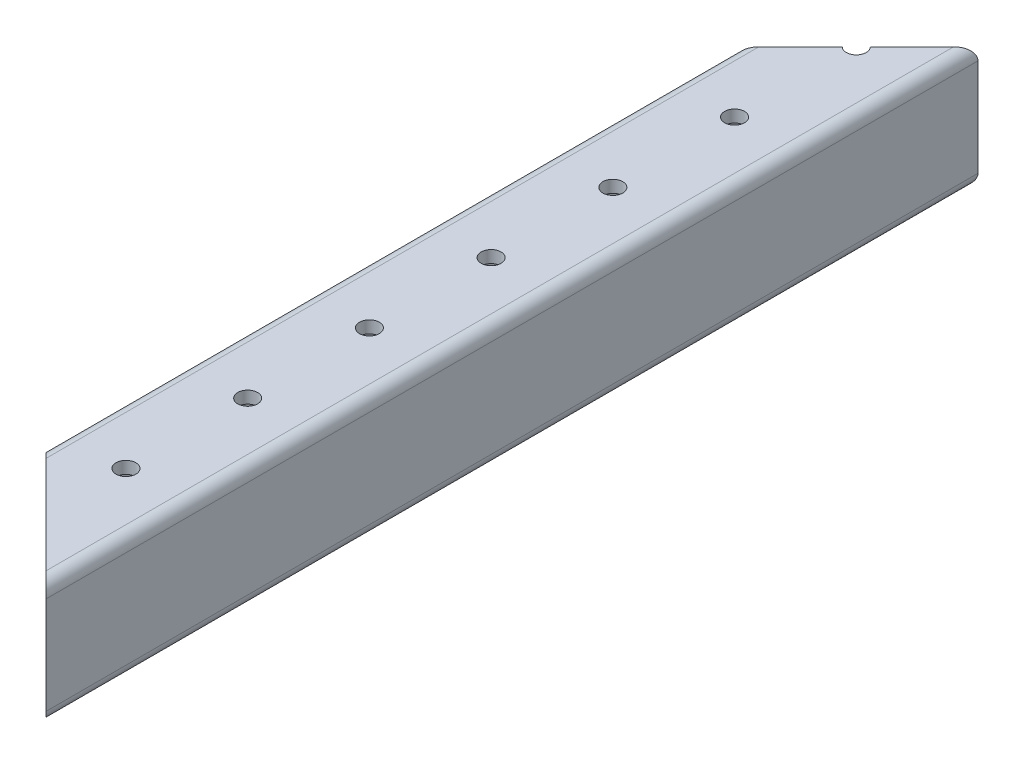
ISO-10303-21;
HEADER;
FILE_DESCRIPTION(('STEP AP214'),'2;1');
FILE_NAME('part.step','',(''),(''),'','','');
FILE_SCHEMA(('AUTOMOTIVE_DESIGN { 1 0 10303 214 1 1 1 1 }'));
ENDSEC;
DATA;
#1=APPLICATION_CONTEXT('core data for automotive mechanical design processes');
#2=APPLICATION_PROTOCOL_DEFINITION('international standard','automotive_design',2000,#1);
#3=PRODUCT_CONTEXT('',#1,'mechanical');
#4=PRODUCT('Part','Part','',(#3));
#5=PRODUCT_RELATED_PRODUCT_CATEGORY('part','',(#4));
#6=PRODUCT_DEFINITION_FORMATION('','',#4);
#7=PRODUCT_DEFINITION_CONTEXT('part definition',#1,'design');
#8=PRODUCT_DEFINITION('design','',#6,#7);
#9=PRODUCT_DEFINITION_SHAPE('','',#8);
#10=(LENGTH_UNIT() NAMED_UNIT(*) SI_UNIT(.MILLI.,.METRE.));
#11=(NAMED_UNIT(*) PLANE_ANGLE_UNIT() SI_UNIT($,.RADIAN.));
#12=(NAMED_UNIT(*) SI_UNIT($,.STERADIAN.) SOLID_ANGLE_UNIT());
#13=UNCERTAINTY_MEASURE_WITH_UNIT(LENGTH_MEASURE(1.E-05),#10,'distance_accuracy_value','');
#14=(GEOMETRIC_REPRESENTATION_CONTEXT(3) GLOBAL_UNCERTAINTY_ASSIGNED_CONTEXT((#13)) GLOBAL_UNIT_ASSIGNED_CONTEXT((#10,
#11,#12)) REPRESENTATION_CONTEXT('',''));
#15=CARTESIAN_POINT('',(0.,0.,0.));
#16=DIRECTION('',(0.,0.,1.));
#17=DIRECTION('',(1.,0.,0.));
#18=AXIS2_PLACEMENT_3D('',#15,#16,#17);
#19=CARTESIAN_POINT('',(283.757951031435,0.,-283.757951031442));
#20=DIRECTION('',(-0.707106781186539,0.,0.707106781186556));
#21=DIRECTION('',(0.707106781186556,0.,0.707106781186539));
#22=AXIS2_PLACEMENT_3D('',#19,#20,#21);
#23=PLANE('',#22);
#24=DIRECTION('',(-0.707106781186556,0.,-0.707106781186539));
#25=VECTOR('',#24,1.);
#26=CARTESIAN_POINT('',(653.327951031435,10.16,85.8120489685489));
#27=LINE('',#26,#25);
#28=CARTESIAN_POINT('',(9.66,10.16,-557.85590206287));
#29=VERTEX_POINT('',#28);
#30=CARTESIAN_POINT('',(-9.65999999999999,10.16,-577.17590206287));
#31=VERTEX_POINT('',#30);
#32=EDGE_CURVE('E424',#29,#31,#27,.T.);
#33=ORIENTED_EDGE('',*,*,#32,.F.);
#34=CARTESIAN_POINT('',(9.66,9.65999999999999,-557.85590206287));
#35=DIRECTION('',(-0.707106781186539,0.,0.707106781186556));
#36=DIRECTION('',(0.707106781186556,0.,0.707106781186539));
#37=AXIS2_PLACEMENT_3D('',#34,#35,#36);
#38=ELLIPSE('',#37,0.707106781186539,0.5);
#39=CARTESIAN_POINT('',(10.16,9.65999999999999,-557.35590206287));
#40=VERTEX_POINT('',#39);
#41=EDGE_CURVE('E437',#29,#40,#38,.F.);
#42=ORIENTED_EDGE('',*,*,#41,.T.);
#43=DIRECTION('',(0.,1.,0.));
#44=VECTOR('',#43,1.);
#45=CARTESIAN_POINT('',(10.16,-10.1600000000002,-557.35590206287));
#46=LINE('',#45,#44);
#47=CARTESIAN_POINT('',(10.16,-9.66,-557.35590206287));
#48=VERTEX_POINT('',#47);
#49=EDGE_CURVE('E445',#48,#40,#46,.T.);
#50=ORIENTED_EDGE('',*,*,#49,.F.);
#51=CARTESIAN_POINT('',(9.66,-9.66,-557.85590206287));
#52=DIRECTION('',(-0.707106781186539,0.,0.707106781186556));
#53=DIRECTION('',(0.707106781186556,0.,0.707106781186539));
#54=AXIS2_PLACEMENT_3D('',#51,#52,#53);
#55=ELLIPSE('',#54,0.707106781186539,0.5);
#56=CARTESIAN_POINT('',(9.66,-10.16,-557.85590206287));
#57=VERTEX_POINT('',#56);
#58=EDGE_CURVE('E452',#48,#57,#55,.F.);
#59=ORIENTED_EDGE('',*,*,#58,.T.);
#60=DIRECTION('',(0.707106781186556,0.,0.707106781186539));
#61=VECTOR('',#60,1.);
#62=CARTESIAN_POINT('',(653.327951031435,-10.16,85.8120489685489));
#63=LINE('',#62,#61);
#64=CARTESIAN_POINT('',(-9.66,-10.16,-577.17590206287));
#65=VERTEX_POINT('',#64);
#66=EDGE_CURVE('E455',#65,#57,#63,.T.);
#67=ORIENTED_EDGE('',*,*,#66,.F.);
#68=CARTESIAN_POINT('',(-9.65999999999999,-9.66,-577.17590206287));
#69=DIRECTION('',(-0.707106781186539,0.,0.707106781186556));
#70=DIRECTION('',(0.707106781186556,0.,0.707106781186539));
#71=AXIS2_PLACEMENT_3D('',#68,#69,#70);
#72=ELLIPSE('',#71,0.707106781186539,0.5);
#73=CARTESIAN_POINT('',(-10.16,-9.66,-577.67590206287));
#74=VERTEX_POINT('',#73);
#75=EDGE_CURVE('E449',#65,#74,#72,.F.);
#76=ORIENTED_EDGE('',*,*,#75,.T.);
#77=DIRECTION('',(0.,-1.,0.));
#78=VECTOR('',#77,1.);
#79=CARTESIAN_POINT('',(-10.16,-10.1600000000002,-577.67590206287));
#80=LINE('',#79,#78);
#81=CARTESIAN_POINT('',(-10.16,9.66,-577.67590206287));
#82=VERTEX_POINT('',#81);
#83=EDGE_CURVE('E441',#82,#74,#80,.T.);
#84=ORIENTED_EDGE('',*,*,#83,.F.);
#85=CARTESIAN_POINT('',(-9.65999999999999,9.66,-577.17590206287));
#86=DIRECTION('',(-0.707106781186539,0.,0.707106781186556));
#87=DIRECTION('',(0.707106781186556,0.,0.707106781186539));
#88=AXIS2_PLACEMENT_3D('',#85,#86,#87);
#89=ELLIPSE('',#88,0.707106781186539,0.5);
#90=EDGE_CURVE('E431',#82,#31,#89,.F.);
#91=ORIENTED_EDGE('',*,*,#90,.T.);
#92=EDGE_LOOP('',(#33,#42,#50,#59,#67,#76,#84,#91));
#93=FACE_BOUND('',#92,.T.);
#94=CARTESIAN_POINT('',(10.16,10.16,-557.35590206287));
#95=DIRECTION('',(-0.707106781186539,0.,0.707106781186556));
#96=DIRECTION('',(-0.707106781186556,0.,-0.707106781186539));
#97=AXIS2_PLACEMENT_3D('',#94,#95,#96);
#98=ELLIPSE('',#97,3.59210244842762,2.54);
#99=CARTESIAN_POINT('',(10.16,12.7,-557.35590206287));
#100=VERTEX_POINT('',#99);
#101=CARTESIAN_POINT('',(12.7,10.16,-554.81590206287));
#102=VERTEX_POINT('',#101);
#103=EDGE_CURVE('E479',#100,#102,#98,.F.);
#104=ORIENTED_EDGE('',*,*,#103,.F.);
#105=DIRECTION('',(-0.707106781186556,0.,-0.707106781186539));
#106=VECTOR('',#105,1.);
#107=CARTESIAN_POINT('',(653.327951031435,12.7,85.8120489685489));
#108=LINE('',#107,#106);
#109=CARTESIAN_POINT('',(-10.16,12.7,-577.67590206287));
#110=VERTEX_POINT('',#109);
#111=EDGE_CURVE('E459',#100,#110,#108,.T.);
#112=ORIENTED_EDGE('',*,*,#111,.T.);
#113=CARTESIAN_POINT('',(-10.16,10.16,-577.67590206287));
#114=DIRECTION('',(-0.707106781186539,0.,0.707106781186556));
#115=DIRECTION('',(-0.707106781186556,0.,-0.707106781186539));
#116=AXIS2_PLACEMENT_3D('',#113,#114,#115);
#117=ELLIPSE('',#116,3.59210244842762,2.54);
#118=CARTESIAN_POINT('',(-12.7,10.16,-580.21590206287));
#119=VERTEX_POINT('',#118);
#120=EDGE_CURVE('E463',#119,#110,#117,.F.);
#121=ORIENTED_EDGE('',*,*,#120,.F.);
#122=DIRECTION('',(0.,-1.,0.));
#123=VECTOR('',#122,1.);
#124=CARTESIAN_POINT('',(-12.7,-10.1600000000002,-580.21590206287));
#125=LINE('',#124,#123);
#126=CARTESIAN_POINT('',(-12.7,-10.16,-580.21590206287));
#127=VERTEX_POINT('',#126);
#128=EDGE_CURVE('E466',#119,#127,#125,.T.);
#129=ORIENTED_EDGE('',*,*,#128,.T.);
#130=CARTESIAN_POINT('',(-10.16,-10.16,-577.67590206287));
#131=DIRECTION('',(-0.707106781186539,0.,0.707106781186556));
#132=DIRECTION('',(-0.707106781186556,0.,-0.707106781186539));
#133=AXIS2_PLACEMENT_3D('',#130,#131,#132);
#134=ELLIPSE('',#133,3.59210244842762,2.54);
#135=CARTESIAN_POINT('',(-10.16,-12.7,-577.67590206287));
#136=VERTEX_POINT('',#135);
#137=EDGE_CURVE('E470',#136,#127,#134,.F.);
#138=ORIENTED_EDGE('',*,*,#137,.F.);
#139=DIRECTION('',(0.707106781186556,0.,0.707106781186539));
#140=VECTOR('',#139,1.);
#141=CARTESIAN_POINT('',(653.327951031435,-12.7,85.8120489685489));
#142=LINE('',#141,#140);
#143=CARTESIAN_POINT('',(10.16,-12.7,-557.35590206287));
#144=VERTEX_POINT('',#143);
#145=EDGE_CURVE('E473',#136,#144,#142,.T.);
#146=ORIENTED_EDGE('',*,*,#145,.T.);
#147=CARTESIAN_POINT('',(10.16,-10.16,-557.35590206287));
#148=DIRECTION('',(-0.707106781186539,0.,0.707106781186556));
#149=DIRECTION('',(-0.707106781186556,0.,-0.707106781186539));
#150=AXIS2_PLACEMENT_3D('',#147,#148,#149);
#151=ELLIPSE('',#150,3.59210244842762,2.54);
#152=CARTESIAN_POINT('',(12.7,-10.16,-554.81590206287));
#153=VERTEX_POINT('',#152);
#154=EDGE_CURVE('E476',#153,#144,#151,.F.);
#155=ORIENTED_EDGE('',*,*,#154,.F.);
#156=DIRECTION('',(0.,1.,0.));
#157=VECTOR('',#156,1.);
#158=CARTESIAN_POINT('',(12.7,-10.1600000000002,-554.81590206287));
#159=LINE('',#158,#157);
#160=EDGE_CURVE('E14',#153,#102,#159,.T.);
#161=ORIENTED_EDGE('',*,*,#160,.T.);
#162=EDGE_LOOP('',(#104,#112,#121,#129,#138,#146,#155,#161));
#163=FACE_BOUND('',#162,.T.);
#164=ADVANCED_FACE('F54',(#93,#163),#23,.T.);
#165=CARTESIAN_POINT('',(-9.65999999999999,9.66,749.3));
#166=DIRECTION('',(0.,0.,1.));
#167=DIRECTION('',(1.,0.,0.));
#168=AXIS2_PLACEMENT_3D('',#165,#166,#167);
#169=CYLINDRICAL_SURFACE('',#168,0.5);
#170=DIRECTION('',(0.,0.,-1.));
#171=VECTOR('',#170,1.);
#172=CARTESIAN_POINT('',(-10.16,9.66,749.3));
#173=LINE('',#172,#171);
#174=CARTESIAN_POINT('',(-10.16,9.66,-726.44));
#175=VERTEX_POINT('',#174);
#176=EDGE_CURVE('E283',#175,#82,#173,.F.);
#177=ORIENTED_EDGE('',*,*,#176,.F.);
#178=CARTESIAN_POINT('',(-9.65999999999999,9.66,-726.94));
#179=DIRECTION('',(0.707106781186549,0.,0.707106781186546));
#180=DIRECTION('',(-0.707106781186546,0.,0.707106781186549));
#181=AXIS2_PLACEMENT_3D('',#178,#179,#180);
#182=ELLIPSE('',#181,0.707106781186549,0.5);
#183=CARTESIAN_POINT('',(-9.66,10.16,-726.94));
#184=VERTEX_POINT('',#183);
#185=EDGE_CURVE('E483',#175,#184,#182,.F.);
#186=ORIENTED_EDGE('',*,*,#185,.T.);
#187=DIRECTION('',(0.,0.,-1.));
#188=VECTOR('',#187,1.);
#189=CARTESIAN_POINT('',(-9.65999999999999,10.16,749.3));
#190=LINE('',#189,#188);
#191=EDGE_CURVE('E353',#31,#184,#190,.T.);
#192=ORIENTED_EDGE('',*,*,#191,.F.);
#193=ORIENTED_EDGE('',*,*,#90,.F.);
#194=EDGE_LOOP('',(#177,#186,#192,#193));
#195=FACE_BOUND('',#194,.T.);
#196=ADVANCED_FACE('F878',(#195),#169,.F.);
#197=CARTESIAN_POINT('',(9.66,9.65999999999999,749.3));
#198=DIRECTION('',(0.,0.,1.));
#199=DIRECTION('',(1.,0.,0.));
#200=AXIS2_PLACEMENT_3D('',#197,#198,#199);
#201=CYLINDRICAL_SURFACE('',#200,0.5);
#202=DIRECTION('',(0.,0.,-1.));
#203=VECTOR('',#202,1.);
#204=CARTESIAN_POINT('',(9.66,10.16,749.3));
#205=LINE('',#204,#203);
#206=CARTESIAN_POINT('',(9.66,10.16,-746.26));
#207=VERTEX_POINT('',#206);
#208=EDGE_CURVE('E357',#207,#29,#205,.F.);
#209=ORIENTED_EDGE('',*,*,#208,.F.);
#210=CARTESIAN_POINT('',(9.66,9.65999999999999,-746.26));
#211=DIRECTION('',(0.707106781186549,0.,0.707106781186546));
#212=DIRECTION('',(-0.707106781186546,0.,0.707106781186549));
#213=AXIS2_PLACEMENT_3D('',#210,#211,#212);
#214=ELLIPSE('',#213,0.707106781186549,0.5);
#215=CARTESIAN_POINT('',(10.16,9.65999999999999,-746.76));
#216=VERTEX_POINT('',#215);
#217=EDGE_CURVE('E81',#207,#216,#214,.F.);
#218=ORIENTED_EDGE('',*,*,#217,.T.);
#219=DIRECTION('',(0.,0.,1.));
#220=VECTOR('',#219,1.);
#221=CARTESIAN_POINT('',(10.16,9.65999999999999,749.3));
#222=LINE('',#221,#220);
#223=EDGE_CURVE('E270',#40,#216,#222,.F.);
#224=ORIENTED_EDGE('',*,*,#223,.F.);
#225=ORIENTED_EDGE('',*,*,#41,.F.);
#226=EDGE_LOOP('',(#209,#218,#224,#225));
#227=FACE_BOUND('',#226,.T.);
#228=ADVANCED_FACE('F869',(#227),#201,.F.);
#229=CARTESIAN_POINT('',(-9.65999999999999,-9.66,749.3));
#230=DIRECTION('',(0.,0.,1.));
#231=DIRECTION('',(1.,0.,0.));
#232=AXIS2_PLACEMENT_3D('',#229,#230,#231);
#233=CYLINDRICAL_SURFACE('',#232,0.5);
#234=DIRECTION('',(0.,0.,1.));
#235=VECTOR('',#234,1.);
#236=CARTESIAN_POINT('',(-9.65999999999999,-10.16,749.3));
#237=LINE('',#236,#235);
#238=CARTESIAN_POINT('',(-9.66,-10.16,-726.94));
#239=VERTEX_POINT('',#238);
#240=EDGE_CURVE('E324',#239,#65,#237,.T.);
#241=ORIENTED_EDGE('',*,*,#240,.F.);
#242=CARTESIAN_POINT('',(-9.65999999999999,-9.66,-726.94));
#243=DIRECTION('',(0.707106781186549,0.,0.707106781186546));
#244=DIRECTION('',(-0.707106781186546,0.,0.707106781186549));
#245=AXIS2_PLACEMENT_3D('',#242,#243,#244);
#246=ELLIPSE('',#245,0.707106781186549,0.5);
#247=CARTESIAN_POINT('',(-10.16,-9.66,-726.44));
#248=VERTEX_POINT('',#247);
#249=EDGE_CURVE('E494',#239,#248,#246,.F.);
#250=ORIENTED_EDGE('',*,*,#249,.T.);
#251=DIRECTION('',(0.,0.,-1.));
#252=VECTOR('',#251,1.);
#253=CARTESIAN_POINT('',(-10.16,-9.66,749.3));
#254=LINE('',#253,#252);
#255=EDGE_CURVE('E278',#74,#248,#254,.T.);
#256=ORIENTED_EDGE('',*,*,#255,.F.);
#257=ORIENTED_EDGE('',*,*,#75,.F.);
#258=EDGE_LOOP('',(#241,#250,#256,#257));
#259=FACE_BOUND('',#258,.T.);
#260=ADVANCED_FACE('F860',(#259),#233,.F.);
#261=CARTESIAN_POINT('',(9.66,-9.66,749.3));
#262=DIRECTION('',(0.,0.,1.));
#263=DIRECTION('',(1.,0.,0.));
#264=AXIS2_PLACEMENT_3D('',#261,#262,#263);
#265=CYLINDRICAL_SURFACE('',#264,0.5);
#266=DIRECTION('',(0.,0.,1.));
#267=VECTOR('',#266,1.);
#268=CARTESIAN_POINT('',(10.16,-9.66,749.3));
#269=LINE('',#268,#267);
#270=CARTESIAN_POINT('',(10.16,-9.66,-746.76));
#271=VERTEX_POINT('',#270);
#272=EDGE_CURVE('E273',#271,#48,#269,.T.);
#273=ORIENTED_EDGE('',*,*,#272,.F.);
#274=CARTESIAN_POINT('',(9.66,-9.66,-746.26));
#275=DIRECTION('',(0.707106781186549,0.,0.707106781186546));
#276=DIRECTION('',(-0.707106781186546,0.,0.707106781186549));
#277=AXIS2_PLACEMENT_3D('',#274,#275,#276);
#278=ELLIPSE('',#277,0.707106781186549,0.5);
#279=CARTESIAN_POINT('',(9.66,-10.16,-746.26));
#280=VERTEX_POINT('',#279);
#281=EDGE_CURVE('E521',#271,#280,#278,.F.);
#282=ORIENTED_EDGE('',*,*,#281,.T.);
#283=DIRECTION('',(0.,0.,1.));
#284=VECTOR('',#283,1.);
#285=CARTESIAN_POINT('',(9.66,-10.16,749.3));
#286=LINE('',#285,#284);
#287=EDGE_CURVE('E320',#57,#280,#286,.F.);
#288=ORIENTED_EDGE('',*,*,#287,.F.);
#289=ORIENTED_EDGE('',*,*,#58,.F.);
#290=EDGE_LOOP('',(#273,#282,#288,#289));
#291=FACE_BOUND('',#290,.T.);
#292=ADVANCED_FACE('F576',(#291),#265,.F.);
#293=CARTESIAN_POINT('',(-10.16,12.7,749.3));
#294=DIRECTION('',(0.,-1.,0.));
#295=DIRECTION('',(0.,0.,-1.));
#296=AXIS2_PLACEMENT_3D('',#293,#294,#295);
#297=PLANE('',#296);
#298=CARTESIAN_POINT('',(0.,12.7,-711.2));
#299=DIRECTION('',(0.,1.,0.));
#300=DIRECTION('',(0.,0.,1.));
#301=AXIS2_PLACEMENT_3D('',#298,#299,#300);
#302=CIRCLE('',#301,2.07009999999996);
#303=CARTESIAN_POINT('',(0.,12.7,-709.1299));
#304=VERTEX_POINT('',#303);
#305=EDGE_CURVE('E421',#304,#304,#302,.T.);
#306=ORIENTED_EDGE('',*,*,#305,.F.);
#307=EDGE_LOOP('',(#306));
#308=FACE_BOUND('',#307,.T.);
#309=DIRECTION('',(0.,0.,-1.));
#310=VECTOR('',#309,1.);
#311=CARTESIAN_POINT('',(10.16,12.7,749.3));
#312=LINE('',#311,#310);
#313=CARTESIAN_POINT('',(10.16,12.7,-746.76));
#314=VERTEX_POINT('',#313);
#315=EDGE_CURVE('E243',#314,#100,#312,.F.);
#316=ORIENTED_EDGE('',*,*,#315,.F.);
#317=DIRECTION('',(-0.707106781186546,0.,0.707106781186549));
#318=VECTOR('',#317,1.);
#319=CARTESIAN_POINT('',(-748.03,12.7,11.4300000000024));
#320=LINE('',#319,#318);
#321=CARTESIAN_POINT('',(1.46378174773417,12.7,-738.063781747734));
#322=VERTEX_POINT('',#321);
#323=EDGE_CURVE('E536',#314,#322,#320,.T.);
#324=ORIENTED_EDGE('',*,*,#323,.T.);
#325=CARTESIAN_POINT('',(0.,12.7,-736.6));
#326=DIRECTION('',(0.,1.,0.));
#327=DIRECTION('',(0.,0.,1.));
#328=AXIS2_PLACEMENT_3D('',#325,#326,#327);
#329=CIRCLE('',#328,2.07009999999996);
#330=CARTESIAN_POINT('',(-1.46378174773448,12.7,-735.136218252266));
#331=VERTEX_POINT('',#330);
#332=EDGE_CURVE('E418',#331,#322,#329,.T.);
#333=ORIENTED_EDGE('',*,*,#332,.F.);
#334=CARTESIAN_POINT('',(-10.16,12.7,-726.44));
#335=VERTEX_POINT('',#334);
#336=EDGE_CURVE('E498',#331,#335,#320,.T.);
#337=ORIENTED_EDGE('',*,*,#336,.T.);
#338=DIRECTION('',(0.,0.,-1.));
#339=VECTOR('',#338,1.);
#340=CARTESIAN_POINT('',(-10.16,12.7,749.3));
#341=LINE('',#340,#339);
#342=EDGE_CURVE('E295',#110,#335,#341,.T.);
#343=ORIENTED_EDGE('',*,*,#342,.F.);
#344=ORIENTED_EDGE('',*,*,#111,.F.);
#345=EDGE_LOOP('',(#316,#324,#333,#337,#343,#344));
#346=FACE_BOUND('',#345,.T.);
#347=CARTESIAN_POINT('',(0.,12.7,-685.8));
#348=DIRECTION('',(0.,1.,0.));
#349=DIRECTION('',(0.,0.,1.));
#350=AXIS2_PLACEMENT_3D('',#347,#348,#349);
#351=CIRCLE('',#350,2.07009999999996);
#352=CARTESIAN_POINT('',(0.,12.7,-683.7299));
#353=VERTEX_POINT('',#352);
#354=EDGE_CURVE('E414',#353,#353,#351,.T.);
#355=ORIENTED_EDGE('',*,*,#354,.F.);
#356=EDGE_LOOP('',(#355));
#357=FACE_BOUND('',#356,.T.);
#358=CARTESIAN_POINT('',(0.,12.7,-660.4));
#359=DIRECTION('',(0.,1.,0.));
#360=DIRECTION('',(0.,0.,1.));
#361=AXIS2_PLACEMENT_3D('',#358,#359,#360);
#362=CIRCLE('',#361,2.07009999999996);
#363=CARTESIAN_POINT('',(0.,12.7,-658.3299));
#364=VERTEX_POINT('',#363);
#365=EDGE_CURVE('E410',#364,#364,#362,.T.);
#366=ORIENTED_EDGE('',*,*,#365,.F.);
#367=EDGE_LOOP('',(#366));
#368=FACE_BOUND('',#367,.T.);
#369=CARTESIAN_POINT('',(0.,12.7,-635.));
#370=DIRECTION('',(0.,1.,0.));
#371=DIRECTION('',(0.,0.,1.));
#372=AXIS2_PLACEMENT_3D('',#369,#370,#371);
#373=CIRCLE('',#372,2.07009999999996);
#374=CARTESIAN_POINT('',(0.,12.7,-632.9299));
#375=VERTEX_POINT('',#374);
#376=EDGE_CURVE('E406',#375,#375,#373,.T.);
#377=ORIENTED_EDGE('',*,*,#376,.F.);
#378=EDGE_LOOP('',(#377));
#379=FACE_BOUND('',#378,.T.);
#380=CARTESIAN_POINT('',(0.,12.7,-609.6));
#381=DIRECTION('',(0.,1.,0.));
#382=DIRECTION('',(0.,0.,1.));
#383=AXIS2_PLACEMENT_3D('',#380,#381,#382);
#384=CIRCLE('',#383,2.07009999999996);
#385=CARTESIAN_POINT('',(0.,12.7,-607.5299));
#386=VERTEX_POINT('',#385);
#387=EDGE_CURVE('E402',#386,#386,#384,.T.);
#388=ORIENTED_EDGE('',*,*,#387,.F.);
#389=EDGE_LOOP('',(#388));
#390=FACE_BOUND('',#389,.T.);
#391=CARTESIAN_POINT('',(0.,12.7,-584.2));
#392=DIRECTION('',(0.,1.,0.));
#393=DIRECTION('',(0.,0.,1.));
#394=AXIS2_PLACEMENT_3D('',#391,#392,#393);
#395=CIRCLE('',#394,2.07009999999996);
#396=CARTESIAN_POINT('',(0.,12.7,-582.1299));
#397=VERTEX_POINT('',#396);
#398=EDGE_CURVE('E398',#397,#397,#395,.T.);
#399=ORIENTED_EDGE('',*,*,#398,.F.);
#400=EDGE_LOOP('',(#399));
#401=FACE_BOUND('',#400,.T.);
#402=ADVANCED_FACE('F569',(#308,#346,#357,#368,#379,#390,#401),#297,.F.);
#403=CARTESIAN_POINT('',(-10.16,10.16,749.3));
#404=DIRECTION('',(0.,0.,-1.));
#405=DIRECTION('',(-1.,0.,0.));
#406=AXIS2_PLACEMENT_3D('',#403,#404,#405);
#407=CYLINDRICAL_SURFACE('',#406,2.54);
#408=CARTESIAN_POINT('',(-10.16,10.16,-726.44));
#409=DIRECTION('',(0.707106781186549,0.,0.707106781186546));
#410=DIRECTION('',(0.707106781186546,0.,-0.707106781186549));
#411=AXIS2_PLACEMENT_3D('',#408,#409,#410);
#412=ELLIPSE('',#411,3.59210244842767,2.54);
#413=CARTESIAN_POINT('',(-12.7,10.16,-723.9));
#414=VERTEX_POINT('',#413);
#415=EDGE_CURVE('E499',#414,#335,#412,.F.);
#416=ORIENTED_EDGE('',*,*,#415,.F.);
#417=DIRECTION('',(0.,0.,-1.));
#418=VECTOR('',#417,1.);
#419=CARTESIAN_POINT('',(-12.7,10.16,749.3));
#420=LINE('',#419,#418);
#421=EDGE_CURVE('E292',#414,#119,#420,.F.);
#422=ORIENTED_EDGE('',*,*,#421,.T.);
#423=ORIENTED_EDGE('',*,*,#120,.T.);
#424=ORIENTED_EDGE('',*,*,#342,.T.);
#425=EDGE_LOOP('',(#416,#422,#423,#424));
#426=FACE_BOUND('',#425,.T.);
#427=ADVANCED_FACE('F575',(#426),#407,.T.);
#428=CARTESIAN_POINT('',(-12.7,-10.16,749.3));
#429=DIRECTION('',(1.,0.,0.));
#430=DIRECTION('',(0.,0.,-1.));
#431=AXIS2_PLACEMENT_3D('',#428,#429,#430);
#432=PLANE('',#431);
#433=ORIENTED_EDGE('',*,*,#421,.F.);
#434=DIRECTION('',(0.,-1.,0.));
#435=VECTOR('',#434,1.);
#436=CARTESIAN_POINT('',(-12.7,-10.16,-723.9));
#437=LINE('',#436,#435);
#438=CARTESIAN_POINT('',(-12.7,-10.16,-723.9));
#439=VERTEX_POINT('',#438);
#440=EDGE_CURVE('E502',#414,#439,#437,.T.);
#441=ORIENTED_EDGE('',*,*,#440,.T.);
#442=DIRECTION('',(0.,0.,-1.));
#443=VECTOR('',#442,1.);
#444=CARTESIAN_POINT('',(-12.7,-10.16,749.3));
#445=LINE('',#444,#443);
#446=EDGE_CURVE('E287',#127,#439,#445,.T.);
#447=ORIENTED_EDGE('',*,*,#446,.F.);
#448=ORIENTED_EDGE('',*,*,#128,.F.);
#449=EDGE_LOOP('',(#433,#441,#447,#448));
#450=FACE_BOUND('',#449,.T.);
#451=ADVANCED_FACE('F584',(#450),#432,.F.);
#452=CARTESIAN_POINT('',(-10.16,-10.16,749.3));
#453=DIRECTION('',(0.,0.,-1.));
#454=DIRECTION('',(-1.,0.,0.));
#455=AXIS2_PLACEMENT_3D('',#452,#453,#454);
#456=CYLINDRICAL_SURFACE('',#455,2.54);
#457=CARTESIAN_POINT('',(-10.16,-10.16,-726.44));
#458=DIRECTION('',(0.707106781186549,0.,0.707106781186546));
#459=DIRECTION('',(0.707106781186546,0.,-0.707106781186549));
#460=AXIS2_PLACEMENT_3D('',#457,#458,#459);
#461=ELLIPSE('',#460,3.59210244842767,2.54);
#462=CARTESIAN_POINT('',(-10.1599999999998,-12.7,-726.44));
#463=VERTEX_POINT('',#462);
#464=EDGE_CURVE('E506',#463,#439,#461,.F.);
#465=ORIENTED_EDGE('',*,*,#464,.F.);
#466=DIRECTION('',(0.,0.,-1.));
#467=VECTOR('',#466,1.);
#468=CARTESIAN_POINT('',(-10.16,-12.7,749.3));
#469=LINE('',#468,#467);
#470=EDGE_CURVE('E385',#463,#136,#469,.F.);
#471=ORIENTED_EDGE('',*,*,#470,.T.);
#472=ORIENTED_EDGE('',*,*,#137,.T.);
#473=ORIENTED_EDGE('',*,*,#446,.T.);
#474=EDGE_LOOP('',(#465,#471,#472,#473));
#475=FACE_BOUND('',#474,.T.);
#476=ADVANCED_FACE('F589',(#475),#456,.T.);
#477=CARTESIAN_POINT('',(-10.16,-12.7,749.3));
#478=DIRECTION('',(0.,1.,0.));
#479=DIRECTION('',(0.,0.,1.));
#480=AXIS2_PLACEMENT_3D('',#477,#478,#479);
#481=PLANE('',#480);
#482=CARTESIAN_POINT('',(0.,-12.7,-711.2));
#483=DIRECTION('',(0.,1.,0.));
#484=DIRECTION('',(0.,0.,1.));
#485=AXIS2_PLACEMENT_3D('',#482,#483,#484);
#486=CIRCLE('',#485,2.07009999999996);
#487=CARTESIAN_POINT('',(0.,-12.7,-709.1299));
#488=VERTEX_POINT('',#487);
#489=EDGE_CURVE('E291',#488,#488,#486,.F.);
#490=ORIENTED_EDGE('',*,*,#489,.F.);
#491=EDGE_LOOP('',(#490));
#492=FACE_BOUND('',#491,.T.);
#493=ORIENTED_EDGE('',*,*,#470,.F.);
#494=DIRECTION('',(0.707106781186546,0.,-0.707106781186549));
#495=VECTOR('',#494,1.);
#496=CARTESIAN_POINT('',(-748.03,-12.7,11.4300000000024));
#497=LINE('',#496,#495);
#498=CARTESIAN_POINT('',(-1.46378174773432,-12.7,-735.136218252266));
#499=VERTEX_POINT('',#498);
#500=EDGE_CURVE('E509',#463,#499,#497,.T.);
#501=ORIENTED_EDGE('',*,*,#500,.T.);
#502=CARTESIAN_POINT('',(0.,-12.7,-736.6));
#503=DIRECTION('',(0.,1.,0.));
#504=DIRECTION('',(0.,0.,1.));
#505=AXIS2_PLACEMENT_3D('',#502,#503,#504);
#506=CIRCLE('',#505,2.07009999999996);
#507=CARTESIAN_POINT('',(1.46378174773417,-12.7,-738.063781747734));
#508=VERTEX_POINT('',#507);
#509=EDGE_CURVE('E388',#508,#499,#506,.F.);
#510=ORIENTED_EDGE('',*,*,#509,.F.);
#511=CARTESIAN_POINT('',(10.16,-12.7,-746.76));
#512=VERTEX_POINT('',#511);
#513=EDGE_CURVE('E254',#508,#512,#497,.T.);
#514=ORIENTED_EDGE('',*,*,#513,.T.);
#515=DIRECTION('',(0.,0.,-1.));
#516=VECTOR('',#515,1.);
#517=CARTESIAN_POINT('',(10.16,-12.7,749.3));
#518=LINE('',#517,#516);
#519=EDGE_CURVE('E250',#144,#512,#518,.T.);
#520=ORIENTED_EDGE('',*,*,#519,.F.);
#521=ORIENTED_EDGE('',*,*,#145,.F.);
#522=EDGE_LOOP('',(#493,#501,#510,#514,#520,#521));
#523=FACE_BOUND('',#522,.T.);
#524=CARTESIAN_POINT('',(0.,-12.7,-685.8));
#525=DIRECTION('',(0.,1.,0.));
#526=DIRECTION('',(0.,0.,1.));
#527=AXIS2_PLACEMENT_3D('',#524,#525,#526);
#528=CIRCLE('',#527,2.07009999999996);
#529=CARTESIAN_POINT('',(0.,-12.7,-683.7299));
#530=VERTEX_POINT('',#529);
#531=EDGE_CURVE('E381',#530,#530,#528,.F.);
#532=ORIENTED_EDGE('',*,*,#531,.F.);
#533=EDGE_LOOP('',(#532));
#534=FACE_BOUND('',#533,.T.);
#535=CARTESIAN_POINT('',(0.,-12.7,-660.4));
#536=DIRECTION('',(0.,1.,0.));
#537=DIRECTION('',(0.,0.,1.));
#538=AXIS2_PLACEMENT_3D('',#535,#536,#537);
#539=CIRCLE('',#538,2.07009999999996);
#540=CARTESIAN_POINT('',(0.,-12.7,-658.3299));
#541=VERTEX_POINT('',#540);
#542=EDGE_CURVE('E377',#541,#541,#539,.F.);
#543=ORIENTED_EDGE('',*,*,#542,.F.);
#544=EDGE_LOOP('',(#543));
#545=FACE_BOUND('',#544,.T.);
#546=CARTESIAN_POINT('',(0.,-12.7,-635.));
#547=DIRECTION('',(0.,1.,0.));
#548=DIRECTION('',(0.,0.,1.));
#549=AXIS2_PLACEMENT_3D('',#546,#547,#548);
#550=CIRCLE('',#549,2.07009999999996);
#551=CARTESIAN_POINT('',(0.,-12.7,-632.9299));
#552=VERTEX_POINT('',#551);
#553=EDGE_CURVE('E373',#552,#552,#550,.F.);
#554=ORIENTED_EDGE('',*,*,#553,.F.);
#555=EDGE_LOOP('',(#554));
#556=FACE_BOUND('',#555,.T.);
#557=CARTESIAN_POINT('',(0.,-12.7,-609.6));
#558=DIRECTION('',(0.,1.,0.));
#559=DIRECTION('',(0.,0.,1.));
#560=AXIS2_PLACEMENT_3D('',#557,#558,#559);
#561=CIRCLE('',#560,2.07009999999996);
#562=CARTESIAN_POINT('',(0.,-12.7,-607.5299));
#563=VERTEX_POINT('',#562);
#564=EDGE_CURVE('E369',#563,#563,#561,.F.);
#565=ORIENTED_EDGE('',*,*,#564,.F.);
#566=EDGE_LOOP('',(#565));
#567=FACE_BOUND('',#566,.T.);
#568=CARTESIAN_POINT('',(0.,-12.7,-584.2));
#569=DIRECTION('',(0.,1.,0.));
#570=DIRECTION('',(0.,0.,1.));
#571=AXIS2_PLACEMENT_3D('',#568,#569,#570);
#572=CIRCLE('',#571,2.07009999999996);
#573=CARTESIAN_POINT('',(0.,-12.7,-582.1299));
#574=VERTEX_POINT('',#573);
#575=EDGE_CURVE('E286',#574,#574,#572,.F.);
#576=ORIENTED_EDGE('',*,*,#575,.F.);
#577=EDGE_LOOP('',(#576));
#578=FACE_BOUND('',#577,.T.);
#579=ADVANCED_FACE('F631',(#492,#523,#534,#545,#556,#567,#578),#481,.F.);
#580=CARTESIAN_POINT('',(-10.16,-10.16,749.3));
#581=DIRECTION('',(1.,0.,0.));
#582=DIRECTION('',(0.,0.,-1.));
#583=AXIS2_PLACEMENT_3D('',#580,#581,#582);
#584=PLANE('',#583);
#585=DIRECTION('',(0.,-1.,0.));
#586=VECTOR('',#585,1.);
#587=CARTESIAN_POINT('',(-10.16,-10.16,-726.44));
#588=LINE('',#587,#586);
#589=EDGE_CURVE('E487',#175,#248,#588,.T.);
#590=ORIENTED_EDGE('',*,*,#589,.F.);
#591=ORIENTED_EDGE('',*,*,#176,.T.);
#592=ORIENTED_EDGE('',*,*,#83,.T.);
#593=ORIENTED_EDGE('',*,*,#255,.T.);
#594=EDGE_LOOP('',(#590,#591,#592,#593));
#595=FACE_BOUND('',#594,.T.);
#596=ADVANCED_FACE('F637',(#595),#584,.T.);
#597=CARTESIAN_POINT('',(-10.16,10.16,749.3));
#598=DIRECTION('',(0.,-1.,0.));
#599=DIRECTION('',(0.,0.,-1.));
#600=AXIS2_PLACEMENT_3D('',#597,#598,#599);
#601=PLANE('',#600);
#602=DIRECTION('',(-0.707106781186546,0.,0.707106781186549));
#603=VECTOR('',#602,1.);
#604=CARTESIAN_POINT('',(-748.03,10.16,11.4300000000024));
#605=LINE('',#604,#603);
#606=CARTESIAN_POINT('',(1.46378174773417,10.16,-738.063781747734));
#607=VERTEX_POINT('',#606);
#608=EDGE_CURVE('E73',#207,#607,#605,.T.);
#609=ORIENTED_EDGE('',*,*,#608,.F.);
#610=ORIENTED_EDGE('',*,*,#208,.T.);
#611=ORIENTED_EDGE('',*,*,#32,.T.);
#612=ORIENTED_EDGE('',*,*,#191,.T.);
#613=CARTESIAN_POINT('',(-1.46378174773432,10.16,-735.136218252266));
#614=VERTEX_POINT('',#613);
#615=EDGE_CURVE('E490',#614,#184,#605,.T.);
#616=ORIENTED_EDGE('',*,*,#615,.F.);
#617=CARTESIAN_POINT('',(0.,10.16,-736.6));
#618=DIRECTION('',(0.,1.,0.));
#619=DIRECTION('',(0.,0.,1.));
#620=AXIS2_PLACEMENT_3D('',#617,#618,#619);
#621=CIRCLE('',#620,2.07009999999996);
#622=EDGE_CURVE('E360',#614,#607,#621,.T.);
#623=ORIENTED_EDGE('',*,*,#622,.T.);
#624=EDGE_LOOP('',(#609,#610,#611,#612,#616,#623));
#625=FACE_BOUND('',#624,.T.);
#626=CARTESIAN_POINT('',(0.,10.16,-711.2));
#627=DIRECTION('',(0.,1.,0.));
#628=DIRECTION('',(0.,0.,1.));
#629=AXIS2_PLACEMENT_3D('',#626,#627,#628);
#630=CIRCLE('',#629,2.07009999999996);
#631=CARTESIAN_POINT('',(0.,10.16,-709.1299));
#632=VERTEX_POINT('',#631);
#633=EDGE_CURVE('E282',#632,#632,#630,.T.);
#634=ORIENTED_EDGE('',*,*,#633,.T.);
#635=EDGE_LOOP('',(#634));
#636=FACE_BOUND('',#635,.T.);
#637=CARTESIAN_POINT('',(0.,10.16,-685.8));
#638=DIRECTION('',(0.,1.,0.));
#639=DIRECTION('',(0.,0.,1.));
#640=AXIS2_PLACEMENT_3D('',#637,#638,#639);
#641=CIRCLE('',#640,2.07009999999996);
#642=CARTESIAN_POINT('',(0.,10.16,-683.7299));
#643=VERTEX_POINT('',#642);
#644=EDGE_CURVE('E349',#643,#643,#641,.T.);
#645=ORIENTED_EDGE('',*,*,#644,.T.);
#646=EDGE_LOOP('',(#645));
#647=FACE_BOUND('',#646,.T.);
#648=CARTESIAN_POINT('',(0.,10.16,-660.4));
#649=DIRECTION('',(0.,1.,0.));
#650=DIRECTION('',(0.,0.,1.));
#651=AXIS2_PLACEMENT_3D('',#648,#649,#650);
#652=CIRCLE('',#651,2.07009999999996);
#653=CARTESIAN_POINT('',(0.,10.16,-658.3299));
#654=VERTEX_POINT('',#653);
#655=EDGE_CURVE('E345',#654,#654,#652,.T.);
#656=ORIENTED_EDGE('',*,*,#655,.T.);
#657=EDGE_LOOP('',(#656));
#658=FACE_BOUND('',#657,.T.);
#659=CARTESIAN_POINT('',(0.,10.16,-635.));
#660=DIRECTION('',(0.,1.,0.));
#661=DIRECTION('',(0.,0.,1.));
#662=AXIS2_PLACEMENT_3D('',#659,#660,#661);
#663=CIRCLE('',#662,2.07009999999996);
#664=CARTESIAN_POINT('',(0.,10.16,-632.9299));
#665=VERTEX_POINT('',#664);
#666=EDGE_CURVE('E341',#665,#665,#663,.T.);
#667=ORIENTED_EDGE('',*,*,#666,.T.);
#668=EDGE_LOOP('',(#667));
#669=FACE_BOUND('',#668,.T.);
#670=CARTESIAN_POINT('',(0.,10.16,-609.6));
#671=DIRECTION('',(0.,1.,0.));
#672=DIRECTION('',(0.,0.,1.));
#673=AXIS2_PLACEMENT_3D('',#670,#671,#672);
#674=CIRCLE('',#673,2.07009999999996);
#675=CARTESIAN_POINT('',(0.,10.16,-607.5299));
#676=VERTEX_POINT('',#675);
#677=EDGE_CURVE('E337',#676,#676,#674,.T.);
#678=ORIENTED_EDGE('',*,*,#677,.T.);
#679=EDGE_LOOP('',(#678));
#680=FACE_BOUND('',#679,.T.);
#681=CARTESIAN_POINT('',(0.,10.16,-584.2));
#682=DIRECTION('',(0.,1.,0.));
#683=DIRECTION('',(0.,0.,1.));
#684=AXIS2_PLACEMENT_3D('',#681,#682,#683);
#685=CIRCLE('',#684,2.07009999999996);
#686=CARTESIAN_POINT('',(0.,10.16,-582.1299));
#687=VERTEX_POINT('',#686);
#688=EDGE_CURVE('E274',#687,#687,#685,.T.);
#689=ORIENTED_EDGE('',*,*,#688,.T.);
#690=EDGE_LOOP('',(#689));
#691=FACE_BOUND('',#690,.T.);
#692=ADVANCED_FACE('F668',(#625,#636,#647,#658,#669,#680,#691),#601,.T.);
#693=CARTESIAN_POINT('',(10.16,-10.16,749.3));
#694=DIRECTION('',(-1.,0.,0.));
#695=DIRECTION('',(0.,0.,1.));
#696=AXIS2_PLACEMENT_3D('',#693,#694,#695);
#697=PLANE('',#696);
#698=DIRECTION('',(0.,1.,0.));
#699=VECTOR('',#698,1.);
#700=CARTESIAN_POINT('',(10.16,-10.16,-746.76));
#701=LINE('',#700,#699);
#702=EDGE_CURVE('E515',#271,#216,#701,.T.);
#703=ORIENTED_EDGE('',*,*,#702,.F.);
#704=ORIENTED_EDGE('',*,*,#272,.T.);
#705=ORIENTED_EDGE('',*,*,#49,.T.);
#706=ORIENTED_EDGE('',*,*,#223,.T.);
#707=EDGE_LOOP('',(#703,#704,#705,#706));
#708=FACE_BOUND('',#707,.T.);
#709=ADVANCED_FACE('F663',(#708),#697,.T.);
#710=CARTESIAN_POINT('',(-10.16,-10.16,749.3));
#711=DIRECTION('',(0.,1.,0.));
#712=DIRECTION('',(0.,0.,1.));
#713=AXIS2_PLACEMENT_3D('',#710,#711,#712);
#714=PLANE('',#713);
#715=DIRECTION('',(0.707106781186546,0.,-0.707106781186549));
#716=VECTOR('',#715,1.);
#717=CARTESIAN_POINT('',(-748.03,-10.16,11.4300000000024));
#718=LINE('',#717,#716);
#719=CARTESIAN_POINT('',(-1.46378174773436,-10.16,-735.136218252266));
#720=VERTEX_POINT('',#719);
#721=EDGE_CURVE('E514',#239,#720,#718,.T.);
#722=ORIENTED_EDGE('',*,*,#721,.F.);
#723=ORIENTED_EDGE('',*,*,#240,.T.);
#724=ORIENTED_EDGE('',*,*,#66,.T.);
#725=ORIENTED_EDGE('',*,*,#287,.T.);
#726=CARTESIAN_POINT('',(1.46378174773417,-10.16,-738.063781747734));
#727=VERTEX_POINT('',#726);
#728=EDGE_CURVE('E526',#727,#280,#718,.T.);
#729=ORIENTED_EDGE('',*,*,#728,.F.);
#730=CARTESIAN_POINT('',(0.,-10.16,-736.6));
#731=DIRECTION('',(0.,1.,0.));
#732=DIRECTION('',(0.,0.,1.));
#733=AXIS2_PLACEMENT_3D('',#730,#731,#732);
#734=CIRCLE('',#733,2.07009999999996);
#735=EDGE_CURVE('E327',#727,#720,#734,.F.);
#736=ORIENTED_EDGE('',*,*,#735,.T.);
#737=EDGE_LOOP('',(#722,#723,#724,#725,#729,#736));
#738=FACE_BOUND('',#737,.T.);
#739=CARTESIAN_POINT('',(0.,-10.16,-711.2));
#740=DIRECTION('',(0.,1.,0.));
#741=DIRECTION('',(0.,0.,1.));
#742=AXIS2_PLACEMENT_3D('',#739,#740,#741);
#743=CIRCLE('',#742,2.07009999999996);
#744=CARTESIAN_POINT('',(0.,-10.16,-709.1299));
#745=VERTEX_POINT('',#744);
#746=EDGE_CURVE('E277',#745,#745,#743,.F.);
#747=ORIENTED_EDGE('',*,*,#746,.T.);
#748=EDGE_LOOP('',(#747));
#749=FACE_BOUND('',#748,.T.);
#750=CARTESIAN_POINT('',(0.,-10.16,-685.8));
#751=DIRECTION('',(0.,1.,0.));
#752=DIRECTION('',(0.,0.,1.));
#753=AXIS2_PLACEMENT_3D('',#750,#751,#752);
#754=CIRCLE('',#753,2.07009999999996);
#755=CARTESIAN_POINT('',(0.,-10.16,-683.7299));
#756=VERTEX_POINT('',#755);
#757=EDGE_CURVE('E316',#756,#756,#754,.F.);
#758=ORIENTED_EDGE('',*,*,#757,.T.);
#759=EDGE_LOOP('',(#758));
#760=FACE_BOUND('',#759,.T.);
#761=CARTESIAN_POINT('',(0.,-10.16,-660.4));
#762=DIRECTION('',(0.,1.,0.));
#763=DIRECTION('',(0.,0.,1.));
#764=AXIS2_PLACEMENT_3D('',#761,#762,#763);
#765=CIRCLE('',#764,2.07009999999996);
#766=CARTESIAN_POINT('',(0.,-10.16,-658.3299));
#767=VERTEX_POINT('',#766);
#768=EDGE_CURVE('E312',#767,#767,#765,.F.);
#769=ORIENTED_EDGE('',*,*,#768,.T.);
#770=EDGE_LOOP('',(#769));
#771=FACE_BOUND('',#770,.T.);
#772=CARTESIAN_POINT('',(0.,-10.16,-635.));
#773=DIRECTION('',(0.,1.,0.));
#774=DIRECTION('',(0.,0.,1.));
#775=AXIS2_PLACEMENT_3D('',#772,#773,#774);
#776=CIRCLE('',#775,2.07009999999996);
#777=CARTESIAN_POINT('',(0.,-10.16,-632.9299));
#778=VERTEX_POINT('',#777);
#779=EDGE_CURVE('E308',#778,#778,#776,.F.);
#780=ORIENTED_EDGE('',*,*,#779,.T.);
#781=EDGE_LOOP('',(#780));
#782=FACE_BOUND('',#781,.T.);
#783=CARTESIAN_POINT('',(0.,-10.16,-609.6));
#784=DIRECTION('',(0.,1.,0.));
#785=DIRECTION('',(0.,0.,1.));
#786=AXIS2_PLACEMENT_3D('',#783,#784,#785);
#787=CIRCLE('',#786,2.07009999999996);
#788=CARTESIAN_POINT('',(0.,-10.16,-607.5299));
#789=VERTEX_POINT('',#788);
#790=EDGE_CURVE('E304',#789,#789,#787,.F.);
#791=ORIENTED_EDGE('',*,*,#790,.T.);
#792=EDGE_LOOP('',(#791));
#793=FACE_BOUND('',#792,.T.);
#794=CARTESIAN_POINT('',(0.,-10.16,-584.2));
#795=DIRECTION('',(0.,1.,0.));
#796=DIRECTION('',(0.,0.,1.));
#797=AXIS2_PLACEMENT_3D('',#794,#795,#796);
#798=CIRCLE('',#797,2.07009999999996);
#799=CARTESIAN_POINT('',(0.,-10.16,-582.1299));
#800=VERTEX_POINT('',#799);
#801=EDGE_CURVE('E300',#800,#800,#798,.F.);
#802=ORIENTED_EDGE('',*,*,#801,.T.);
#803=EDGE_LOOP('',(#802));
#804=FACE_BOUND('',#803,.T.);
#805=ADVANCED_FACE('F624',(#738,#749,#760,#771,#782,#793,#804),#714,.T.);
#806=CARTESIAN_POINT('',(10.16,-10.16,749.3));
#807=DIRECTION('',(0.,0.,-1.));
#808=DIRECTION('',(-1.,0.,0.));
#809=AXIS2_PLACEMENT_3D('',#806,#807,#808);
#810=CYLINDRICAL_SURFACE('',#809,2.54);
#811=CARTESIAN_POINT('',(10.16,-10.16,-746.76));
#812=DIRECTION('',(0.707106781186549,0.,0.707106781186546));
#813=DIRECTION('',(0.707106781186546,0.,-0.707106781186549));
#814=AXIS2_PLACEMENT_3D('',#811,#812,#813);
#815=ELLIPSE('',#814,3.59210244842767,2.54);
#816=CARTESIAN_POINT('',(12.6999999999998,-10.16,-749.3));
#817=VERTEX_POINT('',#816);
#818=EDGE_CURVE('E247',#817,#512,#815,.F.);
#819=ORIENTED_EDGE('',*,*,#818,.F.);
#820=DIRECTION('',(0.,0.,1.));
#821=VECTOR('',#820,1.);
#822=CARTESIAN_POINT('',(12.7,-10.16,749.3));
#823=LINE('',#822,#821);
#824=EDGE_CURVE('E234',#817,#153,#823,.T.);
#825=ORIENTED_EDGE('',*,*,#824,.T.);
#826=ORIENTED_EDGE('',*,*,#154,.T.);
#827=ORIENTED_EDGE('',*,*,#519,.T.);
#828=EDGE_LOOP('',(#819,#825,#826,#827));
#829=FACE_BOUND('',#828,.T.);
#830=ADVANCED_FACE('F248',(#829),#810,.T.);
#831=CARTESIAN_POINT('',(10.16,10.16,749.3));
#832=DIRECTION('',(0.,0.,-1.));
#833=DIRECTION('',(-1.,0.,0.));
#834=AXIS2_PLACEMENT_3D('',#831,#832,#833);
#835=CYLINDRICAL_SURFACE('',#834,2.54);
#836=CARTESIAN_POINT('',(10.16,10.16,-746.76));
#837=DIRECTION('',(0.707106781186549,0.,0.707106781186546));
#838=DIRECTION('',(0.707106781186546,0.,-0.707106781186549));
#839=AXIS2_PLACEMENT_3D('',#836,#837,#838);
#840=ELLIPSE('',#839,3.59210244842767,2.54);
#841=CARTESIAN_POINT('',(12.7,10.16,-749.3));
#842=VERTEX_POINT('',#841);
#843=EDGE_CURVE('E255',#314,#842,#840,.F.);
#844=ORIENTED_EDGE('',*,*,#843,.F.);
#845=ORIENTED_EDGE('',*,*,#315,.T.);
#846=ORIENTED_EDGE('',*,*,#103,.T.);
#847=DIRECTION('',(0.,0.,1.));
#848=VECTOR('',#847,1.);
#849=CARTESIAN_POINT('',(12.7,10.16,749.3));
#850=LINE('',#849,#848);
#851=EDGE_CURVE('E242',#102,#842,#850,.F.);
#852=ORIENTED_EDGE('',*,*,#851,.T.);
#853=EDGE_LOOP('',(#844,#845,#846,#852));
#854=FACE_BOUND('',#853,.T.);
#855=ADVANCED_FACE('F598',(#854),#835,.T.);
#856=CARTESIAN_POINT('',(12.7,-10.16,749.3));
#857=DIRECTION('',(-1.,0.,0.));
#858=DIRECTION('',(0.,0.,1.));
#859=AXIS2_PLACEMENT_3D('',#856,#857,#858);
#860=PLANE('',#859);
#861=ORIENTED_EDGE('',*,*,#160,.F.);
#862=ORIENTED_EDGE('',*,*,#824,.F.);
#863=DIRECTION('',(0.,1.,0.));
#864=VECTOR('',#863,1.);
#865=CARTESIAN_POINT('',(12.7,-10.16,-749.3));
#866=LINE('',#865,#864);
#867=EDGE_CURVE('E63',#842,#817,#866,.F.);
#868=ORIENTED_EDGE('',*,*,#867,.F.);
#869=ORIENTED_EDGE('',*,*,#851,.F.);
#870=EDGE_LOOP('',(#861,#862,#868,#869));
#871=FACE_BOUND('',#870,.T.);
#872=ADVANCED_FACE('F236',(#871),#860,.F.);
#873=CARTESIAN_POINT('',(0.,-12.7,-711.2));
#874=DIRECTION('',(0.,1.,0.));
#875=DIRECTION('',(0.,0.,1.));
#876=AXIS2_PLACEMENT_3D('',#873,#874,#875);
#877=CYLINDRICAL_SURFACE('',#876,2.07009999999996);
#878=ORIENTED_EDGE('',*,*,#633,.F.);
#879=EDGE_LOOP('',(#878));
#880=FACE_BOUND('',#879,.T.);
#881=ORIENTED_EDGE('',*,*,#305,.T.);
#882=EDGE_LOOP('',(#881));
#883=FACE_BOUND('',#882,.T.);
#884=ADVANCED_FACE('F56',(#880,#883),#877,.F.);
#885=CARTESIAN_POINT('',(0.,-12.7,-736.6));
#886=DIRECTION('',(0.,1.,0.));
#887=DIRECTION('',(0.,0.,1.));
#888=AXIS2_PLACEMENT_3D('',#885,#886,#887);
#889=CYLINDRICAL_SURFACE('',#888,2.07009999999996);
#890=ORIENTED_EDGE('',*,*,#332,.T.);
#891=DIRECTION('',(0.,1.,0.));
#892=VECTOR('',#891,1.);
#893=CARTESIAN_POINT('',(1.46378174773417,-12.7,-738.063781747734));
#894=LINE('',#893,#892);
#895=EDGE_CURVE('E530',#322,#607,#894,.F.);
#896=ORIENTED_EDGE('',*,*,#895,.T.);
#897=ORIENTED_EDGE('',*,*,#622,.F.);
#898=DIRECTION('',(0.,1.,0.));
#899=VECTOR('',#898,1.);
#900=CARTESIAN_POINT('',(-1.46378174773432,-12.7,-735.136218252266));
#901=LINE('',#900,#899);
#902=EDGE_CURVE('E491',#614,#331,#901,.T.);
#903=ORIENTED_EDGE('',*,*,#902,.T.);
#904=EDGE_LOOP('',(#890,#896,#897,#903));
#905=FACE_BOUND('',#904,.T.);
#906=ADVANCED_FACE('F795',(#905),#889,.F.);
#907=CARTESIAN_POINT('',(0.,-12.7,-685.8));
#908=DIRECTION('',(0.,1.,0.));
#909=DIRECTION('',(0.,0.,1.));
#910=AXIS2_PLACEMENT_3D('',#907,#908,#909);
#911=CYLINDRICAL_SURFACE('',#910,2.07009999999996);
#912=ORIENTED_EDGE('',*,*,#644,.F.);
#913=EDGE_LOOP('',(#912));
#914=FACE_BOUND('',#913,.T.);
#915=ORIENTED_EDGE('',*,*,#354,.T.);
#916=EDGE_LOOP('',(#915));
#917=FACE_BOUND('',#916,.T.);
#918=ADVANCED_FACE('F786',(#914,#917),#911,.F.);
#919=CARTESIAN_POINT('',(0.,-12.7,-660.4));
#920=DIRECTION('',(0.,1.,0.));
#921=DIRECTION('',(0.,0.,1.));
#922=AXIS2_PLACEMENT_3D('',#919,#920,#921);
#923=CYLINDRICAL_SURFACE('',#922,2.07009999999996);
#924=ORIENTED_EDGE('',*,*,#655,.F.);
#925=EDGE_LOOP('',(#924));
#926=FACE_BOUND('',#925,.T.);
#927=ORIENTED_EDGE('',*,*,#365,.T.);
#928=EDGE_LOOP('',(#927));
#929=FACE_BOUND('',#928,.T.);
#930=ADVANCED_FACE('F777',(#926,#929),#923,.F.);
#931=CARTESIAN_POINT('',(0.,-12.7,-635.));
#932=DIRECTION('',(0.,1.,0.));
#933=DIRECTION('',(0.,0.,1.));
#934=AXIS2_PLACEMENT_3D('',#931,#932,#933);
#935=CYLINDRICAL_SURFACE('',#934,2.07009999999996);
#936=ORIENTED_EDGE('',*,*,#666,.F.);
#937=EDGE_LOOP('',(#936));
#938=FACE_BOUND('',#937,.T.);
#939=ORIENTED_EDGE('',*,*,#376,.T.);
#940=EDGE_LOOP('',(#939));
#941=FACE_BOUND('',#940,.T.);
#942=ADVANCED_FACE('F768',(#938,#941),#935,.F.);
#943=CARTESIAN_POINT('',(0.,-12.7,-609.6));
#944=DIRECTION('',(0.,1.,0.));
#945=DIRECTION('',(0.,0.,1.));
#946=AXIS2_PLACEMENT_3D('',#943,#944,#945);
#947=CYLINDRICAL_SURFACE('',#946,2.07009999999996);
#948=ORIENTED_EDGE('',*,*,#677,.F.);
#949=EDGE_LOOP('',(#948));
#950=FACE_BOUND('',#949,.T.);
#951=ORIENTED_EDGE('',*,*,#387,.T.);
#952=EDGE_LOOP('',(#951));
#953=FACE_BOUND('',#952,.T.);
#954=ADVANCED_FACE('F759',(#950,#953),#947,.F.);
#955=CARTESIAN_POINT('',(0.,-12.7,-584.2));
#956=DIRECTION('',(0.,1.,0.));
#957=DIRECTION('',(0.,0.,1.));
#958=AXIS2_PLACEMENT_3D('',#955,#956,#957);
#959=CYLINDRICAL_SURFACE('',#958,2.07009999999996);
#960=ORIENTED_EDGE('',*,*,#688,.F.);
#961=EDGE_LOOP('',(#960));
#962=FACE_BOUND('',#961,.T.);
#963=ORIENTED_EDGE('',*,*,#398,.T.);
#964=EDGE_LOOP('',(#963));
#965=FACE_BOUND('',#964,.T.);
#966=ADVANCED_FACE('F750',(#962,#965),#959,.F.);
#967=CARTESIAN_POINT('',(0.,-12.7,-711.2));
#968=DIRECTION('',(0.,1.,0.));
#969=DIRECTION('',(0.,0.,1.));
#970=AXIS2_PLACEMENT_3D('',#967,#968,#969);
#971=CYLINDRICAL_SURFACE('',#970,2.07009999999996);
#972=ORIENTED_EDGE('',*,*,#746,.F.);
#973=EDGE_LOOP('',(#972));
#974=FACE_BOUND('',#973,.T.);
#975=ORIENTED_EDGE('',*,*,#489,.T.);
#976=EDGE_LOOP('',(#975));
#977=FACE_BOUND('',#976,.T.);
#978=ADVANCED_FACE('F743',(#974,#977),#971,.F.);
#979=CARTESIAN_POINT('',(0.,-12.7,-736.6));
#980=DIRECTION('',(0.,1.,0.));
#981=DIRECTION('',(0.,0.,1.));
#982=AXIS2_PLACEMENT_3D('',#979,#980,#981);
#983=CYLINDRICAL_SURFACE('',#982,2.07009999999996);
#984=ORIENTED_EDGE('',*,*,#735,.F.);
#985=DIRECTION('',(0.,1.,0.));
#986=VECTOR('',#985,1.);
#987=CARTESIAN_POINT('',(1.46378174773417,-12.7,-738.063781747734));
#988=LINE('',#987,#986);
#989=EDGE_CURVE('E533',#727,#508,#988,.F.);
#990=ORIENTED_EDGE('',*,*,#989,.T.);
#991=ORIENTED_EDGE('',*,*,#509,.T.);
#992=DIRECTION('',(0.,1.,0.));
#993=VECTOR('',#992,1.);
#994=CARTESIAN_POINT('',(-1.46378174773432,-12.7,-735.136218252266));
#995=LINE('',#994,#993);
#996=EDGE_CURVE('E510',#499,#720,#995,.T.);
#997=ORIENTED_EDGE('',*,*,#996,.T.);
#998=EDGE_LOOP('',(#984,#990,#991,#997));
#999=FACE_BOUND('',#998,.T.);
#1000=ADVANCED_FACE('F736',(#999),#983,.F.);
#1001=CARTESIAN_POINT('',(0.,-12.7,-685.8));
#1002=DIRECTION('',(0.,1.,0.));
#1003=DIRECTION('',(0.,0.,1.));
#1004=AXIS2_PLACEMENT_3D('',#1001,#1002,#1003);
#1005=CYLINDRICAL_SURFACE('',#1004,2.07009999999996);
#1006=ORIENTED_EDGE('',*,*,#757,.F.);
#1007=EDGE_LOOP('',(#1006));
#1008=FACE_BOUND('',#1007,.T.);
#1009=ORIENTED_EDGE('',*,*,#531,.T.);
#1010=EDGE_LOOP('',(#1009));
#1011=FACE_BOUND('',#1010,.T.);
#1012=ADVANCED_FACE('F727',(#1008,#1011),#1005,.F.);
#1013=CARTESIAN_POINT('',(0.,-12.7,-660.4));
#1014=DIRECTION('',(0.,1.,0.));
#1015=DIRECTION('',(0.,0.,1.));
#1016=AXIS2_PLACEMENT_3D('',#1013,#1014,#1015);
#1017=CYLINDRICAL_SURFACE('',#1016,2.07009999999996);
#1018=ORIENTED_EDGE('',*,*,#768,.F.);
#1019=EDGE_LOOP('',(#1018));
#1020=FACE_BOUND('',#1019,.T.);
#1021=ORIENTED_EDGE('',*,*,#542,.T.);
#1022=EDGE_LOOP('',(#1021));
#1023=FACE_BOUND('',#1022,.T.);
#1024=ADVANCED_FACE('F718',(#1020,#1023),#1017,.F.);
#1025=CARTESIAN_POINT('',(0.,-12.7,-635.));
#1026=DIRECTION('',(0.,1.,0.));
#1027=DIRECTION('',(0.,0.,1.));
#1028=AXIS2_PLACEMENT_3D('',#1025,#1026,#1027);
#1029=CYLINDRICAL_SURFACE('',#1028,2.07009999999996);
#1030=ORIENTED_EDGE('',*,*,#779,.F.);
#1031=EDGE_LOOP('',(#1030));
#1032=FACE_BOUND('',#1031,.T.);
#1033=ORIENTED_EDGE('',*,*,#553,.T.);
#1034=EDGE_LOOP('',(#1033));
#1035=FACE_BOUND('',#1034,.T.);
#1036=ADVANCED_FACE('F709',(#1032,#1035),#1029,.F.);
#1037=CARTESIAN_POINT('',(0.,-12.7,-609.6));
#1038=DIRECTION('',(0.,1.,0.));
#1039=DIRECTION('',(0.,0.,1.));
#1040=AXIS2_PLACEMENT_3D('',#1037,#1038,#1039);
#1041=CYLINDRICAL_SURFACE('',#1040,2.07009999999996);
#1042=ORIENTED_EDGE('',*,*,#790,.F.);
#1043=EDGE_LOOP('',(#1042));
#1044=FACE_BOUND('',#1043,.T.);
#1045=ORIENTED_EDGE('',*,*,#564,.T.);
#1046=EDGE_LOOP('',(#1045));
#1047=FACE_BOUND('',#1046,.T.);
#1048=ADVANCED_FACE('F699',(#1044,#1047),#1041,.F.);
#1049=CARTESIAN_POINT('',(0.,-12.7,-584.2));
#1050=DIRECTION('',(0.,1.,0.));
#1051=DIRECTION('',(0.,0.,1.));
#1052=AXIS2_PLACEMENT_3D('',#1049,#1050,#1051);
#1053=CYLINDRICAL_SURFACE('',#1052,2.07009999999996);
#1054=ORIENTED_EDGE('',*,*,#801,.F.);
#1055=EDGE_LOOP('',(#1054));
#1056=FACE_BOUND('',#1055,.T.);
#1057=ORIENTED_EDGE('',*,*,#575,.T.);
#1058=EDGE_LOOP('',(#1057));
#1059=FACE_BOUND('',#1058,.T.);
#1060=ADVANCED_FACE('F616',(#1056,#1059),#1053,.F.);
#1061=CARTESIAN_POINT('',(-368.3,0.,-368.299999999999));
#1062=DIRECTION('',(0.707106781186549,0.,0.707106781186546));
#1063=DIRECTION('',(0.707106781186546,0.,-0.707106781186549));
#1064=AXIS2_PLACEMENT_3D('',#1061,#1062,#1063);
#1065=PLANE('',#1064);
#1066=ORIENTED_EDGE('',*,*,#281,.F.);
#1067=ORIENTED_EDGE('',*,*,#702,.T.);
#1068=ORIENTED_EDGE('',*,*,#217,.F.);
#1069=ORIENTED_EDGE('',*,*,#608,.T.);
#1070=ORIENTED_EDGE('',*,*,#895,.F.);
#1071=ORIENTED_EDGE('',*,*,#323,.F.);
#1072=ORIENTED_EDGE('',*,*,#843,.T.);
#1073=ORIENTED_EDGE('',*,*,#867,.T.);
#1074=ORIENTED_EDGE('',*,*,#818,.T.);
#1075=ORIENTED_EDGE('',*,*,#513,.F.);
#1076=ORIENTED_EDGE('',*,*,#989,.F.);
#1077=ORIENTED_EDGE('',*,*,#728,.T.);
#1078=EDGE_LOOP('',(#1066,#1067,#1068,#1069,#1070,#1071,#1072,#1073,#1074,#1075,#1076,#1077));
#1079=FACE_BOUND('',#1078,.T.);
#1080=ADVANCED_FACE('F258',(#1079),#1065,.F.);
#1081=ORIENTED_EDGE('',*,*,#185,.F.);
#1082=ORIENTED_EDGE('',*,*,#589,.T.);
#1083=ORIENTED_EDGE('',*,*,#249,.F.);
#1084=ORIENTED_EDGE('',*,*,#721,.T.);
#1085=ORIENTED_EDGE('',*,*,#996,.F.);
#1086=ORIENTED_EDGE('',*,*,#500,.F.);
#1087=ORIENTED_EDGE('',*,*,#464,.T.);
#1088=ORIENTED_EDGE('',*,*,#440,.F.);
#1089=ORIENTED_EDGE('',*,*,#415,.T.);
#1090=ORIENTED_EDGE('',*,*,#336,.F.);
#1091=ORIENTED_EDGE('',*,*,#902,.F.);
#1092=ORIENTED_EDGE('',*,*,#615,.T.);
#1093=EDGE_LOOP('',(#1081,#1082,#1083,#1084,#1085,#1086,#1087,#1088,#1089,#1090,#1091,#1092));
#1094=FACE_BOUND('',#1093,.T.);
#1095=ADVANCED_FACE('F680',(#1094),#1065,.F.);
#1096=CLOSED_SHELL('',(#164,#196,#228,#260,#292,#402,#427,#451,#476,#579,#596,#692,#709,#805,
#830,#855,#872,#884,#906,#918,#930,#942,#954,#966,#978,#1000,#1012,#1024,#1036,#1048,#1060,
#1080,#1095));
#1097=MANIFOLD_SOLID_BREP('B2',#1096);
#1098=ADVANCED_BREP_SHAPE_REPRESENTATION('',(#18,#1097),#14);
#1099=SHAPE_DEFINITION_REPRESENTATION(#9,#1098);
ENDSEC;
END-ISO-10303-21;
